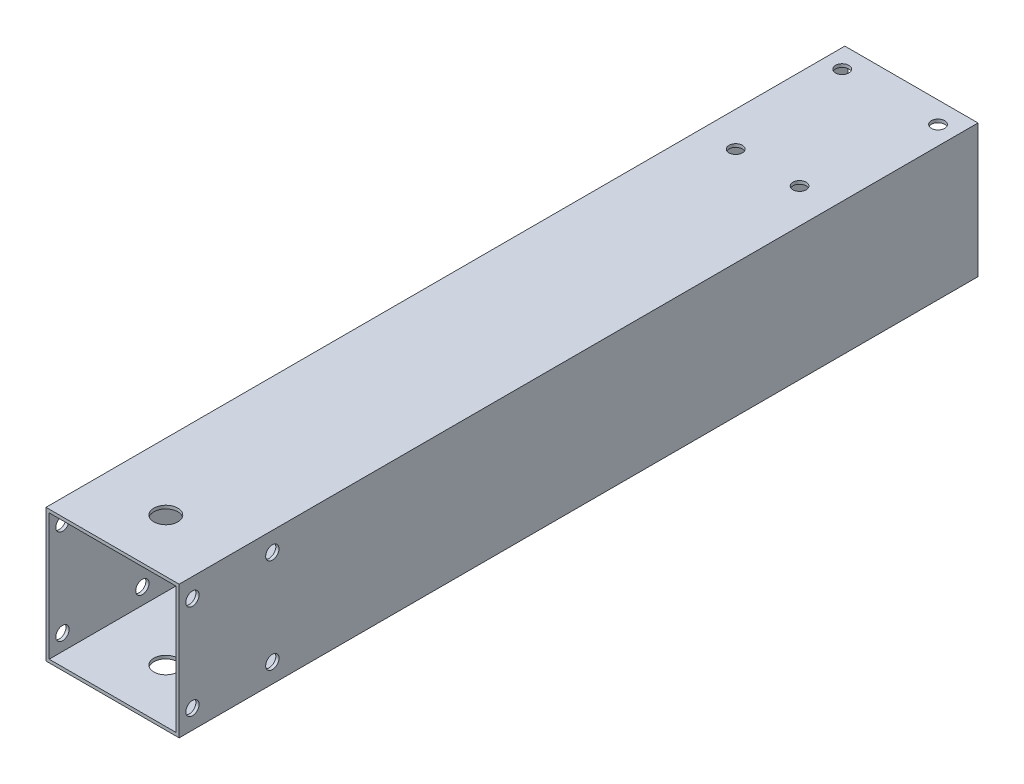
ISO-10303-21;
HEADER;
FILE_DESCRIPTION(('STEP AP214'),'2;1');
FILE_NAME('part.step','',(''),(''),'','','');
FILE_SCHEMA(('AUTOMOTIVE_DESIGN { 1 0 10303 214 1 1 1 1 }'));
ENDSEC;
DATA;
#1=APPLICATION_CONTEXT('core data for automotive mechanical design processes');
#2=APPLICATION_PROTOCOL_DEFINITION('international standard','automotive_design',2000,#1);
#3=PRODUCT_CONTEXT('',#1,'mechanical');
#4=PRODUCT('Part','Part','',(#3));
#5=PRODUCT_RELATED_PRODUCT_CATEGORY('part','',(#4));
#6=PRODUCT_DEFINITION_FORMATION('','',#4);
#7=PRODUCT_DEFINITION_CONTEXT('part definition',#1,'design');
#8=PRODUCT_DEFINITION('design','',#6,#7);
#9=PRODUCT_DEFINITION_SHAPE('','',#8);
#10=(LENGTH_UNIT() NAMED_UNIT(*) SI_UNIT(.MILLI.,.METRE.));
#11=(NAMED_UNIT(*) PLANE_ANGLE_UNIT() SI_UNIT($,.RADIAN.));
#12=(NAMED_UNIT(*) SI_UNIT($,.STERADIAN.) SOLID_ANGLE_UNIT());
#13=UNCERTAINTY_MEASURE_WITH_UNIT(LENGTH_MEASURE(1.E-05),#10,'distance_accuracy_value','');
#14=(GEOMETRIC_REPRESENTATION_CONTEXT(3) GLOBAL_UNCERTAINTY_ASSIGNED_CONTEXT((#13)) GLOBAL_UNIT_ASSIGNED_CONTEXT((#10,
#11,#12)) REPRESENTATION_CONTEXT('',''));
#15=CARTESIAN_POINT('',(0.,0.,0.));
#16=DIRECTION('',(0.,0.,1.));
#17=DIRECTION('',(1.,0.,0.));
#18=AXIS2_PLACEMENT_3D('',#15,#16,#17);
#19=CARTESIAN_POINT('',(0.,0.,300.));
#20=DIRECTION('',(0.,0.,1.));
#21=DIRECTION('',(1.,0.,0.));
#22=AXIS2_PLACEMENT_3D('',#19,#20,#21);
#23=PLANE('',#22);
#24=DIRECTION('',(0.,1.,0.));
#25=VECTOR('',#24,1.);
#26=CARTESIAN_POINT('',(25.,25.,300.));
#27=LINE('',#26,#25);
#28=CARTESIAN_POINT('',(25.,-25.,300.));
#29=VERTEX_POINT('',#28);
#30=CARTESIAN_POINT('',(25.,25.,300.));
#31=VERTEX_POINT('',#30);
#32=EDGE_CURVE('E138',#29,#31,#27,.T.);
#33=ORIENTED_EDGE('',*,*,#32,.T.);
#34=DIRECTION('',(-1.,0.,0.));
#35=VECTOR('',#34,1.);
#36=CARTESIAN_POINT('',(-25.,25.,300.));
#37=LINE('',#36,#35);
#38=CARTESIAN_POINT('',(-25.,25.,300.));
#39=VERTEX_POINT('',#38);
#40=EDGE_CURVE('E141',#31,#39,#37,.T.);
#41=ORIENTED_EDGE('',*,*,#40,.T.);
#42=DIRECTION('',(0.,-1.,0.));
#43=VECTOR('',#42,1.);
#44=CARTESIAN_POINT('',(-25.,25.,300.));
#45=LINE('',#44,#43);
#46=CARTESIAN_POINT('',(-25.,-25.,300.));
#47=VERTEX_POINT('',#46);
#48=EDGE_CURVE('E144',#39,#47,#45,.T.);
#49=ORIENTED_EDGE('',*,*,#48,.T.);
#50=DIRECTION('',(1.,0.,0.));
#51=VECTOR('',#50,1.);
#52=CARTESIAN_POINT('',(-25.,-25.,300.));
#53=LINE('',#52,#51);
#54=EDGE_CURVE('E146',#47,#29,#53,.T.);
#55=ORIENTED_EDGE('',*,*,#54,.T.);
#56=EDGE_LOOP('',(#33,#41,#49,#55));
#57=FACE_BOUND('',#56,.T.);
#58=DIRECTION('',(0.,-1.,0.));
#59=VECTOR('',#58,1.);
#60=CARTESIAN_POINT('',(-23.8,23.8,300.));
#61=LINE('',#60,#59);
#62=CARTESIAN_POINT('',(-23.8,23.8,300.));
#63=VERTEX_POINT('',#62);
#64=CARTESIAN_POINT('',(-23.8,-23.8,300.));
#65=VERTEX_POINT('',#64);
#66=EDGE_CURVE('E108',#63,#65,#61,.T.);
#67=ORIENTED_EDGE('',*,*,#66,.F.);
#68=DIRECTION('',(-1.,0.,0.));
#69=VECTOR('',#68,1.);
#70=CARTESIAN_POINT('',(-23.8,23.8,300.));
#71=LINE('',#70,#69);
#72=CARTESIAN_POINT('',(23.8,23.8,300.));
#73=VERTEX_POINT('',#72);
#74=EDGE_CURVE('E100',#73,#63,#71,.T.);
#75=ORIENTED_EDGE('',*,*,#74,.F.);
#76=DIRECTION('',(0.,1.,0.));
#77=VECTOR('',#76,1.);
#78=CARTESIAN_POINT('',(23.8,23.8,300.));
#79=LINE('',#78,#77);
#80=CARTESIAN_POINT('',(23.8,-23.8,300.));
#81=VERTEX_POINT('',#80);
#82=EDGE_CURVE('E122',#81,#73,#79,.T.);
#83=ORIENTED_EDGE('',*,*,#82,.F.);
#84=DIRECTION('',(1.,0.,0.));
#85=VECTOR('',#84,1.);
#86=CARTESIAN_POINT('',(-23.8,-23.8,300.));
#87=LINE('',#86,#85);
#88=EDGE_CURVE('E120',#65,#81,#87,.T.);
#89=ORIENTED_EDGE('',*,*,#88,.F.);
#90=EDGE_LOOP('',(#67,#75,#83,#89));
#91=FACE_BOUND('',#90,.T.);
#92=ADVANCED_FACE('F33',(#57,#91),#23,.T.);
#93=CARTESIAN_POINT('',(0.,0.,0.));
#94=DIRECTION('',(0.,0.,1.));
#95=DIRECTION('',(1.,0.,0.));
#96=AXIS2_PLACEMENT_3D('',#93,#94,#95);
#97=PLANE('',#96);
#98=DIRECTION('',(0.,1.,0.));
#99=VECTOR('',#98,1.);
#100=CARTESIAN_POINT('',(25.,25.,0.));
#101=LINE('',#100,#99);
#102=CARTESIAN_POINT('',(25.,-25.,0.));
#103=VERTEX_POINT('',#102);
#104=CARTESIAN_POINT('',(25.,25.,0.));
#105=VERTEX_POINT('',#104);
#106=EDGE_CURVE('E116',#103,#105,#101,.T.);
#107=ORIENTED_EDGE('',*,*,#106,.F.);
#108=DIRECTION('',(1.,0.,0.));
#109=VECTOR('',#108,1.);
#110=CARTESIAN_POINT('',(-25.,-25.,0.));
#111=LINE('',#110,#109);
#112=CARTESIAN_POINT('',(-25.,-25.,0.));
#113=VERTEX_POINT('',#112);
#114=EDGE_CURVE('E142',#113,#103,#111,.T.);
#115=ORIENTED_EDGE('',*,*,#114,.F.);
#116=DIRECTION('',(0.,-1.,0.));
#117=VECTOR('',#116,1.);
#118=CARTESIAN_POINT('',(-25.,25.,0.));
#119=LINE('',#118,#117);
#120=CARTESIAN_POINT('',(-25.,25.,0.));
#121=VERTEX_POINT('',#120);
#122=EDGE_CURVE('E153',#121,#113,#119,.T.);
#123=ORIENTED_EDGE('',*,*,#122,.F.);
#124=DIRECTION('',(-1.,0.,0.));
#125=VECTOR('',#124,1.);
#126=CARTESIAN_POINT('',(-25.,25.,0.));
#127=LINE('',#126,#125);
#128=EDGE_CURVE('E151',#105,#121,#127,.T.);
#129=ORIENTED_EDGE('',*,*,#128,.F.);
#130=EDGE_LOOP('',(#107,#115,#123,#129));
#131=FACE_BOUND('',#130,.T.);
#132=DIRECTION('',(-1.,0.,0.));
#133=VECTOR('',#132,1.);
#134=CARTESIAN_POINT('',(-23.8,23.8,0.));
#135=LINE('',#134,#133);
#136=CARTESIAN_POINT('',(23.8,23.8,0.));
#137=VERTEX_POINT('',#136);
#138=CARTESIAN_POINT('',(-23.8,23.8,0.));
#139=VERTEX_POINT('',#138);
#140=EDGE_CURVE('E58',#137,#139,#135,.T.);
#141=ORIENTED_EDGE('',*,*,#140,.T.);
#142=DIRECTION('',(0.,-1.,0.));
#143=VECTOR('',#142,1.);
#144=CARTESIAN_POINT('',(-23.8,23.8,0.));
#145=LINE('',#144,#143);
#146=CARTESIAN_POINT('',(-23.8,-23.8,0.));
#147=VERTEX_POINT('',#146);
#148=EDGE_CURVE('E115',#139,#147,#145,.T.);
#149=ORIENTED_EDGE('',*,*,#148,.T.);
#150=DIRECTION('',(1.,0.,0.));
#151=VECTOR('',#150,1.);
#152=CARTESIAN_POINT('',(-23.8,-23.8,0.));
#153=LINE('',#152,#151);
#154=CARTESIAN_POINT('',(23.8,-23.8,0.));
#155=VERTEX_POINT('',#154);
#156=EDGE_CURVE('E130',#147,#155,#153,.T.);
#157=ORIENTED_EDGE('',*,*,#156,.T.);
#158=DIRECTION('',(0.,1.,0.));
#159=VECTOR('',#158,1.);
#160=CARTESIAN_POINT('',(23.8,23.8,0.));
#161=LINE('',#160,#159);
#162=EDGE_CURVE('E109',#155,#137,#161,.T.);
#163=ORIENTED_EDGE('',*,*,#162,.T.);
#164=EDGE_LOOP('',(#141,#149,#157,#163));
#165=FACE_BOUND('',#164,.T.);
#166=ADVANCED_FACE('F290',(#131,#165),#97,.F.);
#167=CARTESIAN_POINT('',(25.,25.,300.));
#168=DIRECTION('',(-1.,0.,0.));
#169=DIRECTION('',(0.,-1.,0.));
#170=AXIS2_PLACEMENT_3D('',#167,#168,#169);
#171=PLANE('',#170);
#172=CARTESIAN_POINT('',(25.,-17.8,295.));
#173=DIRECTION('',(1.,0.,0.));
#174=DIRECTION('',(0.,1.,0.));
#175=AXIS2_PLACEMENT_3D('',#172,#173,#174);
#176=CIRCLE('',#175,2.50000000000002);
#177=CARTESIAN_POINT('',(25.,-15.3,295.));
#178=VERTEX_POINT('',#177);
#179=EDGE_CURVE('E242',#178,#178,#176,.T.);
#180=ORIENTED_EDGE('',*,*,#179,.F.);
#181=EDGE_LOOP('',(#180));
#182=FACE_BOUND('',#181,.T.);
#183=CARTESIAN_POINT('',(25.,-17.8,265.));
#184=DIRECTION('',(1.,0.,0.));
#185=DIRECTION('',(0.,1.,0.));
#186=AXIS2_PLACEMENT_3D('',#183,#184,#185);
#187=CIRCLE('',#186,2.50000000000002);
#188=CARTESIAN_POINT('',(25.,-15.3,265.));
#189=VERTEX_POINT('',#188);
#190=EDGE_CURVE('E249',#189,#189,#187,.T.);
#191=ORIENTED_EDGE('',*,*,#190,.F.);
#192=EDGE_LOOP('',(#191));
#193=FACE_BOUND('',#192,.T.);
#194=CARTESIAN_POINT('',(25.,17.8,265.));
#195=DIRECTION('',(1.,0.,0.));
#196=DIRECTION('',(0.,1.,0.));
#197=AXIS2_PLACEMENT_3D('',#194,#195,#196);
#198=CIRCLE('',#197,2.50000000000002);
#199=CARTESIAN_POINT('',(25.,20.3,265.));
#200=VERTEX_POINT('',#199);
#201=EDGE_CURVE('E256',#200,#200,#198,.T.);
#202=ORIENTED_EDGE('',*,*,#201,.F.);
#203=EDGE_LOOP('',(#202));
#204=FACE_BOUND('',#203,.T.);
#205=CARTESIAN_POINT('',(25.,17.8,295.));
#206=DIRECTION('',(1.,0.,0.));
#207=DIRECTION('',(0.,1.,0.));
#208=AXIS2_PLACEMENT_3D('',#205,#206,#207);
#209=CIRCLE('',#208,2.50000000000002);
#210=CARTESIAN_POINT('',(25.,20.3,295.));
#211=VERTEX_POINT('',#210);
#212=EDGE_CURVE('E263',#211,#211,#209,.T.);
#213=ORIENTED_EDGE('',*,*,#212,.F.);
#214=EDGE_LOOP('',(#213));
#215=FACE_BOUND('',#214,.T.);
#216=ORIENTED_EDGE('',*,*,#106,.T.);
#217=DIRECTION('',(0.,0.,-1.));
#218=VECTOR('',#217,1.);
#219=CARTESIAN_POINT('',(25.,25.,300.));
#220=LINE('',#219,#218);
#221=EDGE_CURVE('E11',#31,#105,#220,.T.);
#222=ORIENTED_EDGE('',*,*,#221,.F.);
#223=ORIENTED_EDGE('',*,*,#32,.F.);
#224=DIRECTION('',(0.,0.,-1.));
#225=VECTOR('',#224,1.);
#226=CARTESIAN_POINT('',(25.,-25.,300.));
#227=LINE('',#226,#225);
#228=EDGE_CURVE('E148',#29,#103,#227,.T.);
#229=ORIENTED_EDGE('',*,*,#228,.T.);
#230=EDGE_LOOP('',(#216,#222,#223,#229));
#231=FACE_BOUND('',#230,.T.);
#232=ADVANCED_FACE('F35',(#182,#193,#204,#215,#231),#171,.F.);
#233=CARTESIAN_POINT('',(-25.,25.,300.));
#234=DIRECTION('',(0.,-1.,0.));
#235=DIRECTION('',(0.,0.,-1.));
#236=AXIS2_PLACEMENT_3D('',#233,#234,#235);
#237=PLANE('',#236);
#238=CARTESIAN_POINT('',(12.,25.,54.));
#239=DIRECTION('',(0.,-1.,0.));
#240=DIRECTION('',(0.,0.,1.));
#241=AXIS2_PLACEMENT_3D('',#238,#239,#240);
#242=CIRCLE('',#241,2.5);
#243=CARTESIAN_POINT('',(12.,25.,56.5));
#244=VERTEX_POINT('',#243);
#245=EDGE_CURVE('E314',#244,#244,#242,.T.);
#246=ORIENTED_EDGE('',*,*,#245,.T.);
#247=EDGE_LOOP('',(#246));
#248=FACE_BOUND('',#247,.T.);
#249=CARTESIAN_POINT('',(18.,25.,8.));
#250=DIRECTION('',(0.,-1.,0.));
#251=DIRECTION('',(0.,0.,1.));
#252=AXIS2_PLACEMENT_3D('',#249,#250,#251);
#253=CIRCLE('',#252,2.5);
#254=CARTESIAN_POINT('',(18.,25.,10.5));
#255=VERTEX_POINT('',#254);
#256=EDGE_CURVE('E204',#255,#255,#253,.T.);
#257=ORIENTED_EDGE('',*,*,#256,.T.);
#258=EDGE_LOOP('',(#257));
#259=FACE_BOUND('',#258,.T.);
#260=CARTESIAN_POINT('',(-12.,25.,54.));
#261=DIRECTION('',(0.,-1.,0.));
#262=DIRECTION('',(0.,0.,-1.));
#263=AXIS2_PLACEMENT_3D('',#260,#261,#262);
#264=CIRCLE('',#263,2.5);
#265=CARTESIAN_POINT('',(-12.,25.,51.5));
#266=VERTEX_POINT('',#265);
#267=EDGE_CURVE('E200',#266,#266,#264,.T.);
#268=ORIENTED_EDGE('',*,*,#267,.T.);
#269=EDGE_LOOP('',(#268));
#270=FACE_BOUND('',#269,.T.);
#271=CARTESIAN_POINT('',(-18.,25.,8.));
#272=DIRECTION('',(0.,-1.,0.));
#273=DIRECTION('',(0.,0.,-1.));
#274=AXIS2_PLACEMENT_3D('',#271,#272,#273);
#275=CIRCLE('',#274,2.5);
#276=CARTESIAN_POINT('',(-18.,25.,5.5));
#277=VERTEX_POINT('',#276);
#278=EDGE_CURVE('E196',#277,#277,#275,.T.);
#279=ORIENTED_EDGE('',*,*,#278,.T.);
#280=EDGE_LOOP('',(#279));
#281=FACE_BOUND('',#280,.T.);
#282=CARTESIAN_POINT('',(0.,25.,280.));
#283=DIRECTION('',(0.,1.,0.));
#284=DIRECTION('',(0.,0.,1.));
#285=AXIS2_PLACEMENT_3D('',#282,#283,#284);
#286=CIRCLE('',#285,4.5);
#287=CARTESIAN_POINT('',(0.,25.,284.5));
#288=VERTEX_POINT('',#287);
#289=EDGE_CURVE('E190',#288,#288,#286,.T.);
#290=ORIENTED_EDGE('',*,*,#289,.F.);
#291=EDGE_LOOP('',(#290));
#292=FACE_BOUND('',#291,.T.);
#293=ORIENTED_EDGE('',*,*,#128,.T.);
#294=DIRECTION('',(0.,0.,-1.));
#295=VECTOR('',#294,1.);
#296=CARTESIAN_POINT('',(-25.,25.,300.));
#297=LINE('',#296,#295);
#298=EDGE_CURVE('E42',#39,#121,#297,.T.);
#299=ORIENTED_EDGE('',*,*,#298,.F.);
#300=ORIENTED_EDGE('',*,*,#40,.F.);
#301=ORIENTED_EDGE('',*,*,#221,.T.);
#302=EDGE_LOOP('',(#293,#299,#300,#301));
#303=FACE_BOUND('',#302,.T.);
#304=ADVANCED_FACE('F304',(#248,#259,#270,#281,#292,#303),#237,.F.);
#305=CARTESIAN_POINT('',(-25.,25.,300.));
#306=DIRECTION('',(1.,0.,0.));
#307=DIRECTION('',(0.,1.,0.));
#308=AXIS2_PLACEMENT_3D('',#305,#306,#307);
#309=PLANE('',#308);
#310=CARTESIAN_POINT('',(-25.,-17.8,295.));
#311=DIRECTION('',(1.,0.,0.));
#312=DIRECTION('',(0.,1.,0.));
#313=AXIS2_PLACEMENT_3D('',#310,#311,#312);
#314=CIRCLE('',#313,2.50000000000002);
#315=CARTESIAN_POINT('',(-25.,-15.3,295.));
#316=VERTEX_POINT('',#315);
#317=EDGE_CURVE('E181',#316,#316,#314,.T.);
#318=ORIENTED_EDGE('',*,*,#317,.T.);
#319=EDGE_LOOP('',(#318));
#320=FACE_BOUND('',#319,.T.);
#321=CARTESIAN_POINT('',(-25.,-17.8,265.));
#322=DIRECTION('',(1.,0.,0.));
#323=DIRECTION('',(0.,1.,0.));
#324=AXIS2_PLACEMENT_3D('',#321,#322,#323);
#325=CIRCLE('',#324,2.50000000000002);
#326=CARTESIAN_POINT('',(-25.,-15.3,265.));
#327=VERTEX_POINT('',#326);
#328=EDGE_CURVE('E176',#327,#327,#325,.T.);
#329=ORIENTED_EDGE('',*,*,#328,.T.);
#330=EDGE_LOOP('',(#329));
#331=FACE_BOUND('',#330,.T.);
#332=CARTESIAN_POINT('',(-25.,17.8,265.));
#333=DIRECTION('',(1.,0.,0.));
#334=DIRECTION('',(0.,1.,0.));
#335=AXIS2_PLACEMENT_3D('',#332,#333,#334);
#336=CIRCLE('',#335,2.50000000000002);
#337=CARTESIAN_POINT('',(-25.,20.3,265.));
#338=VERTEX_POINT('',#337);
#339=EDGE_CURVE('E171',#338,#338,#336,.T.);
#340=ORIENTED_EDGE('',*,*,#339,.T.);
#341=EDGE_LOOP('',(#340));
#342=FACE_BOUND('',#341,.T.);
#343=CARTESIAN_POINT('',(-25.,17.8,295.));
#344=DIRECTION('',(1.,0.,0.));
#345=DIRECTION('',(0.,1.,0.));
#346=AXIS2_PLACEMENT_3D('',#343,#344,#345);
#347=CIRCLE('',#346,2.50000000000002);
#348=CARTESIAN_POINT('',(-25.,20.3,295.));
#349=VERTEX_POINT('',#348);
#350=EDGE_CURVE('E166',#349,#349,#347,.T.);
#351=ORIENTED_EDGE('',*,*,#350,.T.);
#352=EDGE_LOOP('',(#351));
#353=FACE_BOUND('',#352,.T.);
#354=ORIENTED_EDGE('',*,*,#122,.T.);
#355=DIRECTION('',(0.,0.,-1.));
#356=VECTOR('',#355,1.);
#357=CARTESIAN_POINT('',(-25.,-25.,300.));
#358=LINE('',#357,#356);
#359=EDGE_CURVE('E158',#47,#113,#358,.T.);
#360=ORIENTED_EDGE('',*,*,#359,.F.);
#361=ORIENTED_EDGE('',*,*,#48,.F.);
#362=ORIENTED_EDGE('',*,*,#298,.T.);
#363=EDGE_LOOP('',(#354,#360,#361,#362));
#364=FACE_BOUND('',#363,.T.);
#365=ADVANCED_FACE('F301',(#320,#331,#342,#353,#364),#309,.F.);
#366=CARTESIAN_POINT('',(-25.,-25.,300.));
#367=DIRECTION('',(0.,1.,0.));
#368=DIRECTION('',(0.,0.,1.));
#369=AXIS2_PLACEMENT_3D('',#366,#367,#368);
#370=PLANE('',#369);
#371=CARTESIAN_POINT('',(12.,-25.,54.));
#372=DIRECTION('',(0.,-1.,0.));
#373=DIRECTION('',(0.,0.,1.));
#374=AXIS2_PLACEMENT_3D('',#371,#372,#373);
#375=CIRCLE('',#374,2.5);
#376=CARTESIAN_POINT('',(12.,-25.,56.5));
#377=VERTEX_POINT('',#376);
#378=EDGE_CURVE('E402',#377,#377,#375,.T.);
#379=ORIENTED_EDGE('',*,*,#378,.F.);
#380=EDGE_LOOP('',(#379));
#381=FACE_BOUND('',#380,.T.);
#382=CARTESIAN_POINT('',(18.,-25.,8.));
#383=DIRECTION('',(0.,-1.,0.));
#384=DIRECTION('',(0.,0.,1.));
#385=AXIS2_PLACEMENT_3D('',#382,#383,#384);
#386=CIRCLE('',#385,2.5);
#387=CARTESIAN_POINT('',(18.,-25.,10.5));
#388=VERTEX_POINT('',#387);
#389=EDGE_CURVE('E211',#388,#388,#386,.T.);
#390=ORIENTED_EDGE('',*,*,#389,.F.);
#391=EDGE_LOOP('',(#390));
#392=FACE_BOUND('',#391,.T.);
#393=CARTESIAN_POINT('',(-12.,-25.,54.));
#394=DIRECTION('',(0.,-1.,0.));
#395=DIRECTION('',(0.,0.,-1.));
#396=AXIS2_PLACEMENT_3D('',#393,#394,#395);
#397=CIRCLE('',#396,2.5);
#398=CARTESIAN_POINT('',(-12.,-25.,51.5));
#399=VERTEX_POINT('',#398);
#400=EDGE_CURVE('E208',#399,#399,#397,.T.);
#401=ORIENTED_EDGE('',*,*,#400,.F.);
#402=EDGE_LOOP('',(#401));
#403=FACE_BOUND('',#402,.T.);
#404=CARTESIAN_POINT('',(-18.,-25.,8.));
#405=DIRECTION('',(0.,-1.,0.));
#406=DIRECTION('',(0.,0.,-1.));
#407=AXIS2_PLACEMENT_3D('',#404,#405,#406);
#408=CIRCLE('',#407,2.5);
#409=CARTESIAN_POINT('',(-18.,-25.,5.5));
#410=VERTEX_POINT('',#409);
#411=EDGE_CURVE('E227',#410,#410,#408,.T.);
#412=ORIENTED_EDGE('',*,*,#411,.F.);
#413=EDGE_LOOP('',(#412));
#414=FACE_BOUND('',#413,.T.);
#415=CARTESIAN_POINT('',(0.,-25.,30.));
#416=DIRECTION('',(0.,-1.,0.));
#417=DIRECTION('',(0.,0.,-1.));
#418=AXIS2_PLACEMENT_3D('',#415,#416,#417);
#419=CIRCLE('',#418,8.);
#420=CARTESIAN_POINT('',(0.,-25.,22.));
#421=VERTEX_POINT('',#420);
#422=EDGE_CURVE('E191',#421,#421,#419,.T.);
#423=ORIENTED_EDGE('',*,*,#422,.F.);
#424=EDGE_LOOP('',(#423));
#425=FACE_BOUND('',#424,.T.);
#426=CARTESIAN_POINT('',(0.,-25.,280.));
#427=DIRECTION('',(0.,1.,0.));
#428=DIRECTION('',(0.,0.,1.));
#429=AXIS2_PLACEMENT_3D('',#426,#427,#428);
#430=CIRCLE('',#429,4.5);
#431=CARTESIAN_POINT('',(0.,-25.,284.5));
#432=VERTEX_POINT('',#431);
#433=EDGE_CURVE('E186',#432,#432,#430,.T.);
#434=ORIENTED_EDGE('',*,*,#433,.T.);
#435=EDGE_LOOP('',(#434));
#436=FACE_BOUND('',#435,.T.);
#437=ORIENTED_EDGE('',*,*,#114,.T.);
#438=ORIENTED_EDGE('',*,*,#228,.F.);
#439=ORIENTED_EDGE('',*,*,#54,.F.);
#440=ORIENTED_EDGE('',*,*,#359,.T.);
#441=EDGE_LOOP('',(#437,#438,#439,#440));
#442=FACE_BOUND('',#441,.T.);
#443=ADVANCED_FACE('F284',(#381,#392,#403,#414,#425,#436,#442),#370,.F.);
#444=CARTESIAN_POINT('',(-23.8,23.8,300.));
#445=DIRECTION('',(0.,-1.,0.));
#446=DIRECTION('',(0.,0.,-1.));
#447=AXIS2_PLACEMENT_3D('',#444,#445,#446);
#448=PLANE('',#447);
#449=CARTESIAN_POINT('',(12.,23.8,54.));
#450=DIRECTION('',(0.,-1.,0.));
#451=DIRECTION('',(0.,0.,-1.));
#452=AXIS2_PLACEMENT_3D('',#449,#450,#451);
#453=CIRCLE('',#452,2.5);
#454=CARTESIAN_POINT('',(12.,23.8,51.5));
#455=VERTEX_POINT('',#454);
#456=EDGE_CURVE('E216',#455,#455,#453,.T.);
#457=ORIENTED_EDGE('',*,*,#456,.F.);
#458=EDGE_LOOP('',(#457));
#459=FACE_BOUND('',#458,.T.);
#460=CARTESIAN_POINT('',(18.,23.8,8.));
#461=DIRECTION('',(0.,-1.,0.));
#462=DIRECTION('',(0.,0.,-1.));
#463=AXIS2_PLACEMENT_3D('',#460,#461,#462);
#464=CIRCLE('',#463,2.5);
#465=CARTESIAN_POINT('',(18.,23.8,5.5));
#466=VERTEX_POINT('',#465);
#467=EDGE_CURVE('E203',#466,#466,#464,.T.);
#468=ORIENTED_EDGE('',*,*,#467,.F.);
#469=EDGE_LOOP('',(#468));
#470=FACE_BOUND('',#469,.T.);
#471=CARTESIAN_POINT('',(-12.,23.8,54.));
#472=DIRECTION('',(0.,-1.,0.));
#473=DIRECTION('',(0.,0.,-1.));
#474=AXIS2_PLACEMENT_3D('',#471,#472,#473);
#475=CIRCLE('',#474,2.5);
#476=CARTESIAN_POINT('',(-12.,23.8,51.5));
#477=VERTEX_POINT('',#476);
#478=EDGE_CURVE('E199',#477,#477,#475,.T.);
#479=ORIENTED_EDGE('',*,*,#478,.F.);
#480=EDGE_LOOP('',(#479));
#481=FACE_BOUND('',#480,.T.);
#482=CARTESIAN_POINT('',(-18.,23.8,8.));
#483=DIRECTION('',(0.,-1.,0.));
#484=DIRECTION('',(0.,0.,-1.));
#485=AXIS2_PLACEMENT_3D('',#482,#483,#484);
#486=CIRCLE('',#485,2.5);
#487=CARTESIAN_POINT('',(-18.,23.8,5.5));
#488=VERTEX_POINT('',#487);
#489=EDGE_CURVE('E195',#488,#488,#486,.T.);
#490=ORIENTED_EDGE('',*,*,#489,.F.);
#491=EDGE_LOOP('',(#490));
#492=FACE_BOUND('',#491,.T.);
#493=CARTESIAN_POINT('',(0.,23.8,280.));
#494=DIRECTION('',(0.,-1.,0.));
#495=DIRECTION('',(0.,0.,-1.));
#496=AXIS2_PLACEMENT_3D('',#493,#494,#495);
#497=CIRCLE('',#496,4.5);
#498=CARTESIAN_POINT('',(0.,23.8,275.5));
#499=VERTEX_POINT('',#498);
#500=EDGE_CURVE('E185',#499,#499,#497,.T.);
#501=ORIENTED_EDGE('',*,*,#500,.F.);
#502=EDGE_LOOP('',(#501));
#503=FACE_BOUND('',#502,.T.);
#504=ORIENTED_EDGE('',*,*,#140,.F.);
#505=DIRECTION('',(0.,0.,-1.));
#506=VECTOR('',#505,1.);
#507=CARTESIAN_POINT('',(23.8,23.8,300.));
#508=LINE('',#507,#506);
#509=EDGE_CURVE('E104',#73,#137,#508,.T.);
#510=ORIENTED_EDGE('',*,*,#509,.F.);
#511=ORIENTED_EDGE('',*,*,#74,.T.);
#512=DIRECTION('',(0.,0.,-1.));
#513=VECTOR('',#512,1.);
#514=CARTESIAN_POINT('',(-23.8,23.8,300.));
#515=LINE('',#514,#513);
#516=EDGE_CURVE('E103',#63,#139,#515,.T.);
#517=ORIENTED_EDGE('',*,*,#516,.T.);
#518=EDGE_LOOP('',(#504,#510,#511,#517));
#519=FACE_BOUND('',#518,.T.);
#520=ADVANCED_FACE('F102',(#459,#470,#481,#492,#503,#519),#448,.T.);
#521=CARTESIAN_POINT('',(-23.8,23.8,300.));
#522=DIRECTION('',(1.,0.,0.));
#523=DIRECTION('',(0.,1.,0.));
#524=AXIS2_PLACEMENT_3D('',#521,#522,#523);
#525=PLANE('',#524);
#526=CARTESIAN_POINT('',(-23.8,-17.8,295.));
#527=DIRECTION('',(1.,0.,0.));
#528=DIRECTION('',(0.,1.,0.));
#529=AXIS2_PLACEMENT_3D('',#526,#527,#528);
#530=CIRCLE('',#529,2.50000000000002);
#531=CARTESIAN_POINT('',(-23.8,-15.3,295.));
#532=VERTEX_POINT('',#531);
#533=EDGE_CURVE('E180',#532,#532,#530,.T.);
#534=ORIENTED_EDGE('',*,*,#533,.F.);
#535=EDGE_LOOP('',(#534));
#536=FACE_BOUND('',#535,.T.);
#537=CARTESIAN_POINT('',(-23.8,-17.8,265.));
#538=DIRECTION('',(1.,0.,0.));
#539=DIRECTION('',(0.,1.,0.));
#540=AXIS2_PLACEMENT_3D('',#537,#538,#539);
#541=CIRCLE('',#540,2.50000000000002);
#542=CARTESIAN_POINT('',(-23.8,-15.3,265.));
#543=VERTEX_POINT('',#542);
#544=EDGE_CURVE('E175',#543,#543,#541,.T.);
#545=ORIENTED_EDGE('',*,*,#544,.F.);
#546=EDGE_LOOP('',(#545));
#547=FACE_BOUND('',#546,.T.);
#548=CARTESIAN_POINT('',(-23.8,17.8,265.));
#549=DIRECTION('',(1.,0.,0.));
#550=DIRECTION('',(0.,1.,0.));
#551=AXIS2_PLACEMENT_3D('',#548,#549,#550);
#552=CIRCLE('',#551,2.50000000000002);
#553=CARTESIAN_POINT('',(-23.8,20.3,265.));
#554=VERTEX_POINT('',#553);
#555=EDGE_CURVE('E170',#554,#554,#552,.T.);
#556=ORIENTED_EDGE('',*,*,#555,.F.);
#557=EDGE_LOOP('',(#556));
#558=FACE_BOUND('',#557,.T.);
#559=CARTESIAN_POINT('',(-23.8,17.8,295.));
#560=DIRECTION('',(1.,0.,0.));
#561=DIRECTION('',(0.,1.,0.));
#562=AXIS2_PLACEMENT_3D('',#559,#560,#561);
#563=CIRCLE('',#562,2.50000000000002);
#564=CARTESIAN_POINT('',(-23.8,20.3,295.));
#565=VERTEX_POINT('',#564);
#566=EDGE_CURVE('E128',#565,#565,#563,.T.);
#567=ORIENTED_EDGE('',*,*,#566,.F.);
#568=EDGE_LOOP('',(#567));
#569=FACE_BOUND('',#568,.T.);
#570=ORIENTED_EDGE('',*,*,#148,.F.);
#571=ORIENTED_EDGE('',*,*,#516,.F.);
#572=ORIENTED_EDGE('',*,*,#66,.T.);
#573=DIRECTION('',(0.,0.,-1.));
#574=VECTOR('',#573,1.);
#575=CARTESIAN_POINT('',(-23.8,-23.8,300.));
#576=LINE('',#575,#574);
#577=EDGE_CURVE('E117',#65,#147,#576,.T.);
#578=ORIENTED_EDGE('',*,*,#577,.T.);
#579=EDGE_LOOP('',(#570,#571,#572,#578));
#580=FACE_BOUND('',#579,.T.);
#581=ADVANCED_FACE('F112',(#536,#547,#558,#569,#580),#525,.T.);
#582=CARTESIAN_POINT('',(-23.8,-23.8,300.));
#583=DIRECTION('',(0.,1.,0.));
#584=DIRECTION('',(0.,0.,1.));
#585=AXIS2_PLACEMENT_3D('',#582,#583,#584);
#586=PLANE('',#585);
#587=CARTESIAN_POINT('',(12.,-23.8,54.));
#588=DIRECTION('',(0.,1.,0.));
#589=DIRECTION('',(0.,0.,1.));
#590=AXIS2_PLACEMENT_3D('',#587,#588,#589);
#591=CIRCLE('',#590,2.5);
#592=CARTESIAN_POINT('',(12.,-23.8,56.5));
#593=VERTEX_POINT('',#592);
#594=EDGE_CURVE('E37',#593,#593,#591,.T.);
#595=ORIENTED_EDGE('',*,*,#594,.F.);
#596=EDGE_LOOP('',(#595));
#597=FACE_BOUND('',#596,.T.);
#598=CARTESIAN_POINT('',(18.,-23.8,8.));
#599=DIRECTION('',(0.,1.,0.));
#600=DIRECTION('',(0.,0.,1.));
#601=AXIS2_PLACEMENT_3D('',#598,#599,#600);
#602=CIRCLE('',#601,2.5);
#603=CARTESIAN_POINT('',(18.,-23.8,10.5));
#604=VERTEX_POINT('',#603);
#605=EDGE_CURVE('E201',#604,#604,#602,.T.);
#606=ORIENTED_EDGE('',*,*,#605,.F.);
#607=EDGE_LOOP('',(#606));
#608=FACE_BOUND('',#607,.T.);
#609=CARTESIAN_POINT('',(-12.,-23.8,54.));
#610=DIRECTION('',(0.,1.,0.));
#611=DIRECTION('',(0.,0.,1.));
#612=AXIS2_PLACEMENT_3D('',#609,#610,#611);
#613=CIRCLE('',#612,2.5);
#614=CARTESIAN_POINT('',(-12.,-23.8,56.5));
#615=VERTEX_POINT('',#614);
#616=EDGE_CURVE('E197',#615,#615,#613,.T.);
#617=ORIENTED_EDGE('',*,*,#616,.F.);
#618=EDGE_LOOP('',(#617));
#619=FACE_BOUND('',#618,.T.);
#620=CARTESIAN_POINT('',(-18.,-23.8,8.));
#621=DIRECTION('',(0.,1.,0.));
#622=DIRECTION('',(0.,0.,1.));
#623=AXIS2_PLACEMENT_3D('',#620,#621,#622);
#624=CIRCLE('',#623,2.5);
#625=CARTESIAN_POINT('',(-18.,-23.8,10.5));
#626=VERTEX_POINT('',#625);
#627=EDGE_CURVE('E192',#626,#626,#624,.T.);
#628=ORIENTED_EDGE('',*,*,#627,.F.);
#629=EDGE_LOOP('',(#628));
#630=FACE_BOUND('',#629,.T.);
#631=CARTESIAN_POINT('',(0.,-23.8,30.));
#632=DIRECTION('',(0.,1.,0.));
#633=DIRECTION('',(0.,0.,1.));
#634=AXIS2_PLACEMENT_3D('',#631,#632,#633);
#635=CIRCLE('',#634,8.);
#636=CARTESIAN_POINT('',(0.,-23.8,38.));
#637=VERTEX_POINT('',#636);
#638=EDGE_CURVE('E187',#637,#637,#635,.T.);
#639=ORIENTED_EDGE('',*,*,#638,.F.);
#640=EDGE_LOOP('',(#639));
#641=FACE_BOUND('',#640,.T.);
#642=CARTESIAN_POINT('',(0.,-23.8,280.));
#643=DIRECTION('',(0.,1.,0.));
#644=DIRECTION('',(0.,0.,1.));
#645=AXIS2_PLACEMENT_3D('',#642,#643,#644);
#646=CIRCLE('',#645,4.5);
#647=CARTESIAN_POINT('',(0.,-23.8,284.5));
#648=VERTEX_POINT('',#647);
#649=EDGE_CURVE('E182',#648,#648,#646,.T.);
#650=ORIENTED_EDGE('',*,*,#649,.F.);
#651=EDGE_LOOP('',(#650));
#652=FACE_BOUND('',#651,.T.);
#653=ORIENTED_EDGE('',*,*,#156,.F.);
#654=ORIENTED_EDGE('',*,*,#577,.F.);
#655=ORIENTED_EDGE('',*,*,#88,.T.);
#656=DIRECTION('',(0.,0.,-1.));
#657=VECTOR('',#656,1.);
#658=CARTESIAN_POINT('',(23.8,-23.8,300.));
#659=LINE('',#658,#657);
#660=EDGE_CURVE('E50',#81,#155,#659,.T.);
#661=ORIENTED_EDGE('',*,*,#660,.T.);
#662=EDGE_LOOP('',(#653,#654,#655,#661));
#663=FACE_BOUND('',#662,.T.);
#664=ADVANCED_FACE('F274',(#597,#608,#619,#630,#641,#652,#663),#586,.T.);
#665=CARTESIAN_POINT('',(23.8,23.8,300.));
#666=DIRECTION('',(-1.,0.,0.));
#667=DIRECTION('',(0.,-1.,0.));
#668=AXIS2_PLACEMENT_3D('',#665,#666,#667);
#669=PLANE('',#668);
#670=CARTESIAN_POINT('',(23.8,-17.8,295.));
#671=DIRECTION('',(-1.,0.,0.));
#672=DIRECTION('',(0.,-1.,0.));
#673=AXIS2_PLACEMENT_3D('',#670,#671,#672);
#674=CIRCLE('',#673,2.50000000000002);
#675=CARTESIAN_POINT('',(23.8,-20.3000000000001,295.));
#676=VERTEX_POINT('',#675);
#677=EDGE_CURVE('E177',#676,#676,#674,.T.);
#678=ORIENTED_EDGE('',*,*,#677,.F.);
#679=EDGE_LOOP('',(#678));
#680=FACE_BOUND('',#679,.T.);
#681=CARTESIAN_POINT('',(23.8,-17.8,265.));
#682=DIRECTION('',(-1.,0.,0.));
#683=DIRECTION('',(0.,-1.,0.));
#684=AXIS2_PLACEMENT_3D('',#681,#682,#683);
#685=CIRCLE('',#684,2.50000000000002);
#686=CARTESIAN_POINT('',(23.8,-20.3,265.));
#687=VERTEX_POINT('',#686);
#688=EDGE_CURVE('E172',#687,#687,#685,.T.);
#689=ORIENTED_EDGE('',*,*,#688,.F.);
#690=EDGE_LOOP('',(#689));
#691=FACE_BOUND('',#690,.T.);
#692=CARTESIAN_POINT('',(23.8,17.8,265.));
#693=DIRECTION('',(-1.,0.,0.));
#694=DIRECTION('',(0.,-1.,0.));
#695=AXIS2_PLACEMENT_3D('',#692,#693,#694);
#696=CIRCLE('',#695,2.50000000000002);
#697=CARTESIAN_POINT('',(23.8,15.3,265.));
#698=VERTEX_POINT('',#697);
#699=EDGE_CURVE('E167',#698,#698,#696,.T.);
#700=ORIENTED_EDGE('',*,*,#699,.F.);
#701=EDGE_LOOP('',(#700));
#702=FACE_BOUND('',#701,.T.);
#703=CARTESIAN_POINT('',(23.8,17.8,295.));
#704=DIRECTION('',(-1.,0.,0.));
#705=DIRECTION('',(0.,-1.,0.));
#706=AXIS2_PLACEMENT_3D('',#703,#704,#705);
#707=CIRCLE('',#706,2.50000000000002);
#708=CARTESIAN_POINT('',(23.8,15.2999999999999,295.));
#709=VERTEX_POINT('',#708);
#710=EDGE_CURVE('E163',#709,#709,#707,.T.);
#711=ORIENTED_EDGE('',*,*,#710,.F.);
#712=EDGE_LOOP('',(#711));
#713=FACE_BOUND('',#712,.T.);
#714=ORIENTED_EDGE('',*,*,#162,.F.);
#715=ORIENTED_EDGE('',*,*,#660,.F.);
#716=ORIENTED_EDGE('',*,*,#82,.T.);
#717=ORIENTED_EDGE('',*,*,#509,.T.);
#718=EDGE_LOOP('',(#714,#715,#716,#717));
#719=FACE_BOUND('',#718,.T.);
#720=ADVANCED_FACE('F281',(#680,#691,#702,#713,#719),#669,.T.);
#721=CARTESIAN_POINT('',(-25.,17.8,295.));
#722=DIRECTION('',(1.,0.,0.));
#723=DIRECTION('',(0.,1.,0.));
#724=AXIS2_PLACEMENT_3D('',#721,#722,#723);
#725=CYLINDRICAL_SURFACE('',#724,2.50000000000002);
#726=ORIENTED_EDGE('',*,*,#710,.T.);
#727=EDGE_LOOP('',(#726));
#728=FACE_BOUND('',#727,.T.);
#729=ORIENTED_EDGE('',*,*,#212,.T.);
#730=EDGE_LOOP('',(#729));
#731=FACE_BOUND('',#730,.T.);
#732=ADVANCED_FACE('F338',(#728,#731),#725,.F.);
#733=ORIENTED_EDGE('',*,*,#566,.T.);
#734=EDGE_LOOP('',(#733));
#735=FACE_BOUND('',#734,.T.);
#736=ORIENTED_EDGE('',*,*,#350,.F.);
#737=EDGE_LOOP('',(#736));
#738=FACE_BOUND('',#737,.T.);
#739=ADVANCED_FACE('F270',(#735,#738),#725,.F.);
#740=CARTESIAN_POINT('',(-25.,17.8,265.));
#741=DIRECTION('',(1.,0.,0.));
#742=DIRECTION('',(0.,1.,0.));
#743=AXIS2_PLACEMENT_3D('',#740,#741,#742);
#744=CYLINDRICAL_SURFACE('',#743,2.50000000000002);
#745=ORIENTED_EDGE('',*,*,#699,.T.);
#746=EDGE_LOOP('',(#745));
#747=FACE_BOUND('',#746,.T.);
#748=ORIENTED_EDGE('',*,*,#201,.T.);
#749=EDGE_LOOP('',(#748));
#750=FACE_BOUND('',#749,.T.);
#751=ADVANCED_FACE('F349',(#747,#750),#744,.F.);
#752=ORIENTED_EDGE('',*,*,#555,.T.);
#753=EDGE_LOOP('',(#752));
#754=FACE_BOUND('',#753,.T.);
#755=ORIENTED_EDGE('',*,*,#339,.F.);
#756=EDGE_LOOP('',(#755));
#757=FACE_BOUND('',#756,.T.);
#758=ADVANCED_FACE('F352',(#754,#757),#744,.F.);
#759=CARTESIAN_POINT('',(-25.,-17.8,265.));
#760=DIRECTION('',(1.,0.,0.));
#761=DIRECTION('',(0.,1.,0.));
#762=AXIS2_PLACEMENT_3D('',#759,#760,#761);
#763=CYLINDRICAL_SURFACE('',#762,2.50000000000002);
#764=ORIENTED_EDGE('',*,*,#688,.T.);
#765=EDGE_LOOP('',(#764));
#766=FACE_BOUND('',#765,.T.);
#767=ORIENTED_EDGE('',*,*,#190,.T.);
#768=EDGE_LOOP('',(#767));
#769=FACE_BOUND('',#768,.T.);
#770=ADVANCED_FACE('F354',(#766,#769),#763,.F.);
#771=ORIENTED_EDGE('',*,*,#544,.T.);
#772=EDGE_LOOP('',(#771));
#773=FACE_BOUND('',#772,.T.);
#774=ORIENTED_EDGE('',*,*,#328,.F.);
#775=EDGE_LOOP('',(#774));
#776=FACE_BOUND('',#775,.T.);
#777=ADVANCED_FACE('F357',(#773,#776),#763,.F.);
#778=CARTESIAN_POINT('',(-25.,-17.8,295.));
#779=DIRECTION('',(1.,0.,0.));
#780=DIRECTION('',(0.,1.,0.));
#781=AXIS2_PLACEMENT_3D('',#778,#779,#780);
#782=CYLINDRICAL_SURFACE('',#781,2.50000000000002);
#783=ORIENTED_EDGE('',*,*,#677,.T.);
#784=EDGE_LOOP('',(#783));
#785=FACE_BOUND('',#784,.T.);
#786=ORIENTED_EDGE('',*,*,#179,.T.);
#787=EDGE_LOOP('',(#786));
#788=FACE_BOUND('',#787,.T.);
#789=ADVANCED_FACE('F359',(#785,#788),#782,.F.);
#790=ORIENTED_EDGE('',*,*,#533,.T.);
#791=EDGE_LOOP('',(#790));
#792=FACE_BOUND('',#791,.T.);
#793=ORIENTED_EDGE('',*,*,#317,.F.);
#794=EDGE_LOOP('',(#793));
#795=FACE_BOUND('',#794,.T.);
#796=ADVANCED_FACE('F362',(#792,#795),#782,.F.);
#797=CARTESIAN_POINT('',(0.,-25.,280.));
#798=DIRECTION('',(0.,1.,0.));
#799=DIRECTION('',(0.,0.,1.));
#800=AXIS2_PLACEMENT_3D('',#797,#798,#799);
#801=CYLINDRICAL_SURFACE('',#800,4.5);
#802=ORIENTED_EDGE('',*,*,#649,.T.);
#803=EDGE_LOOP('',(#802));
#804=FACE_BOUND('',#803,.T.);
#805=ORIENTED_EDGE('',*,*,#433,.F.);
#806=EDGE_LOOP('',(#805));
#807=FACE_BOUND('',#806,.T.);
#808=ADVANCED_FACE('F364',(#804,#807),#801,.F.);
#809=ORIENTED_EDGE('',*,*,#500,.T.);
#810=EDGE_LOOP('',(#809));
#811=FACE_BOUND('',#810,.T.);
#812=ORIENTED_EDGE('',*,*,#289,.T.);
#813=EDGE_LOOP('',(#812));
#814=FACE_BOUND('',#813,.T.);
#815=ADVANCED_FACE('F367',(#811,#814),#801,.F.);
#816=CARTESIAN_POINT('',(0.,-23.,30.));
#817=DIRECTION('',(0.,-1.,0.));
#818=DIRECTION('',(0.,0.,-1.));
#819=AXIS2_PLACEMENT_3D('',#816,#817,#818);
#820=CYLINDRICAL_SURFACE('',#819,8.);
#821=ORIENTED_EDGE('',*,*,#638,.T.);
#822=EDGE_LOOP('',(#821));
#823=FACE_BOUND('',#822,.T.);
#824=ORIENTED_EDGE('',*,*,#422,.T.);
#825=EDGE_LOOP('',(#824));
#826=FACE_BOUND('',#825,.T.);
#827=ADVANCED_FACE('F369',(#823,#826),#820,.F.);
#828=CARTESIAN_POINT('',(-18.,25.,8.));
#829=DIRECTION('',(0.,-1.,0.));
#830=DIRECTION('',(0.,0.,-1.));
#831=AXIS2_PLACEMENT_3D('',#828,#829,#830);
#832=CYLINDRICAL_SURFACE('',#831,2.5);
#833=ORIENTED_EDGE('',*,*,#627,.T.);
#834=EDGE_LOOP('',(#833));
#835=FACE_BOUND('',#834,.T.);
#836=ORIENTED_EDGE('',*,*,#411,.T.);
#837=EDGE_LOOP('',(#836));
#838=FACE_BOUND('',#837,.T.);
#839=ADVANCED_FACE('F372',(#835,#838),#832,.F.);
#840=ORIENTED_EDGE('',*,*,#489,.T.);
#841=EDGE_LOOP('',(#840));
#842=FACE_BOUND('',#841,.T.);
#843=ORIENTED_EDGE('',*,*,#278,.F.);
#844=EDGE_LOOP('',(#843));
#845=FACE_BOUND('',#844,.T.);
#846=ADVANCED_FACE('F376',(#842,#845),#832,.F.);
#847=CARTESIAN_POINT('',(-12.,25.,54.));
#848=DIRECTION('',(0.,-1.,0.));
#849=DIRECTION('',(0.,0.,-1.));
#850=AXIS2_PLACEMENT_3D('',#847,#848,#849);
#851=CYLINDRICAL_SURFACE('',#850,2.5);
#852=ORIENTED_EDGE('',*,*,#616,.T.);
#853=EDGE_LOOP('',(#852));
#854=FACE_BOUND('',#853,.T.);
#855=ORIENTED_EDGE('',*,*,#400,.T.);
#856=EDGE_LOOP('',(#855));
#857=FACE_BOUND('',#856,.T.);
#858=ADVANCED_FACE('F378',(#854,#857),#851,.F.);
#859=ORIENTED_EDGE('',*,*,#478,.T.);
#860=EDGE_LOOP('',(#859));
#861=FACE_BOUND('',#860,.T.);
#862=ORIENTED_EDGE('',*,*,#267,.F.);
#863=EDGE_LOOP('',(#862));
#864=FACE_BOUND('',#863,.T.);
#865=ADVANCED_FACE('F381',(#861,#864),#851,.F.);
#866=CARTESIAN_POINT('',(18.,25.,8.));
#867=DIRECTION('',(0.,-1.,0.));
#868=DIRECTION('',(0.,0.,-1.));
#869=AXIS2_PLACEMENT_3D('',#866,#867,#868);
#870=CYLINDRICAL_SURFACE('',#869,2.5);
#871=ORIENTED_EDGE('',*,*,#605,.T.);
#872=EDGE_LOOP('',(#871));
#873=FACE_BOUND('',#872,.T.);
#874=ORIENTED_EDGE('',*,*,#389,.T.);
#875=EDGE_LOOP('',(#874));
#876=FACE_BOUND('',#875,.T.);
#877=ADVANCED_FACE('F383',(#873,#876),#870,.F.);
#878=ORIENTED_EDGE('',*,*,#467,.T.);
#879=EDGE_LOOP('',(#878));
#880=FACE_BOUND('',#879,.T.);
#881=ORIENTED_EDGE('',*,*,#256,.F.);
#882=EDGE_LOOP('',(#881));
#883=FACE_BOUND('',#882,.T.);
#884=ADVANCED_FACE('F386',(#880,#883),#870,.F.);
#885=CARTESIAN_POINT('',(12.,25.,54.));
#886=DIRECTION('',(0.,-1.,0.));
#887=DIRECTION('',(0.,0.,-1.));
#888=AXIS2_PLACEMENT_3D('',#885,#886,#887);
#889=CYLINDRICAL_SURFACE('',#888,2.5);
#890=ORIENTED_EDGE('',*,*,#594,.T.);
#891=EDGE_LOOP('',(#890));
#892=FACE_BOUND('',#891,.T.);
#893=ORIENTED_EDGE('',*,*,#378,.T.);
#894=EDGE_LOOP('',(#893));
#895=FACE_BOUND('',#894,.T.);
#896=ADVANCED_FACE('F387',(#892,#895),#889,.F.);
#897=ORIENTED_EDGE('',*,*,#456,.T.);
#898=EDGE_LOOP('',(#897));
#899=FACE_BOUND('',#898,.T.);
#900=ORIENTED_EDGE('',*,*,#245,.F.);
#901=EDGE_LOOP('',(#900));
#902=FACE_BOUND('',#901,.T.);
#903=ADVANCED_FACE('F389',(#899,#902),#889,.F.);
#904=CLOSED_SHELL('',(#92,#166,#232,#304,#365,#443,#520,#581,#664,#720,#732,#739,#751,#758,#770,
#777,#789,#796,#808,#815,#827,#839,#846,#858,#865,#877,#884,#896,#903));
#905=MANIFOLD_SOLID_BREP('B2',#904);
#906=ADVANCED_BREP_SHAPE_REPRESENTATION('',(#18,#905),#14);
#907=SHAPE_DEFINITION_REPRESENTATION(#9,#906);
ENDSEC;
END-ISO-10303-21;
